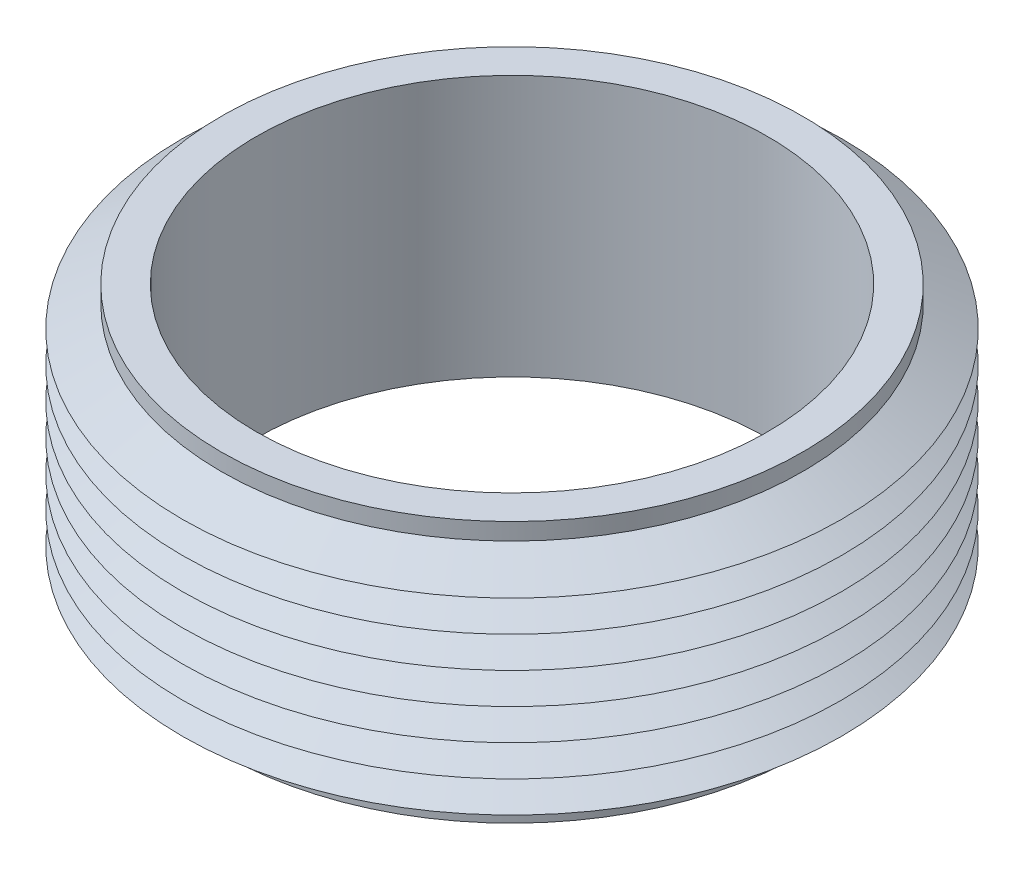
ISO-10303-21;
HEADER;
FILE_DESCRIPTION(('STEP AP214'),'2;1');
FILE_NAME('part.step','',(''),(''),'','','');
FILE_SCHEMA(('AUTOMOTIVE_DESIGN { 1 0 10303 214 1 1 1 1 }'));
ENDSEC;
DATA;
#1=APPLICATION_CONTEXT('core data for automotive mechanical design processes');
#2=APPLICATION_PROTOCOL_DEFINITION('international standard','automotive_design',2000,#1);
#3=PRODUCT_CONTEXT('',#1,'mechanical');
#4=PRODUCT('Part','Part','',(#3));
#5=PRODUCT_RELATED_PRODUCT_CATEGORY('part','',(#4));
#6=PRODUCT_DEFINITION_FORMATION('','',#4);
#7=PRODUCT_DEFINITION_CONTEXT('part definition',#1,'design');
#8=PRODUCT_DEFINITION('design','',#6,#7);
#9=PRODUCT_DEFINITION_SHAPE('','',#8);
#10=(LENGTH_UNIT() NAMED_UNIT(*) SI_UNIT(.MILLI.,.METRE.));
#11=(NAMED_UNIT(*) PLANE_ANGLE_UNIT() SI_UNIT($,.RADIAN.));
#12=(NAMED_UNIT(*) SI_UNIT($,.STERADIAN.) SOLID_ANGLE_UNIT());
#13=UNCERTAINTY_MEASURE_WITH_UNIT(LENGTH_MEASURE(1.E-05),#10,'distance_accuracy_value','');
#14=(GEOMETRIC_REPRESENTATION_CONTEXT(3) GLOBAL_UNCERTAINTY_ASSIGNED_CONTEXT((#13)) GLOBAL_UNIT_ASSIGNED_CONTEXT((#10,
#11,#12)) REPRESENTATION_CONTEXT('',''));
#15=CARTESIAN_POINT('',(0.,0.,0.));
#16=DIRECTION('',(0.,0.,1.));
#17=DIRECTION('',(1.,0.,0.));
#18=AXIS2_PLACEMENT_3D('',#15,#16,#17);
#19=CARTESIAN_POINT('',(40.5,-1.,0.));
#20=DIRECTION('',(0.,1.,0.));
#21=DIRECTION('',(0.,0.,1.));
#22=AXIS2_PLACEMENT_3D('',#19,#20,#21);
#23=PLANE('',#22);
#24=CARTESIAN_POINT('',(0.,-1.,0.));
#25=DIRECTION('',(0.,1.,0.));
#26=DIRECTION('',(0.,0.,1.));
#27=AXIS2_PLACEMENT_3D('',#24,#25,#26);
#28=CIRCLE('',#27,41.5);
#29=CARTESIAN_POINT('',(0.,-1.,41.5));
#30=VERTEX_POINT('',#29);
#31=EDGE_CURVE('E10',#30,#30,#28,.T.);
#32=ORIENTED_EDGE('',*,*,#31,.F.);
#33=EDGE_LOOP('',(#32));
#34=FACE_BOUND('',#33,.T.);
#35=CARTESIAN_POINT('',(0.,-1.,0.));
#36=DIRECTION('',(0.,1.,0.));
#37=DIRECTION('',(0.,0.,1.));
#38=AXIS2_PLACEMENT_3D('',#35,#36,#37);
#39=CIRCLE('',#38,36.5);
#40=CARTESIAN_POINT('',(0.,-1.,36.5));
#41=VERTEX_POINT('',#40);
#42=EDGE_CURVE('E93',#41,#41,#39,.T.);
#43=ORIENTED_EDGE('',*,*,#42,.T.);
#44=EDGE_LOOP('',(#43));
#45=FACE_BOUND('',#44,.T.);
#46=ADVANCED_FACE('F32',(#34,#45),#23,.F.);
#47=CARTESIAN_POINT('',(0.,76.3194927690471,0.));
#48=DIRECTION('',(0.,1.,0.));
#49=DIRECTION('',(0.,0.,1.));
#50=AXIS2_PLACEMENT_3D('',#47,#48,#49);
#51=CYLINDRICAL_SURFACE('',#50,41.5);
#52=CARTESIAN_POINT('',(0.,1.36100673955093,0.));
#53=DIRECTION('',(0.,1.,0.));
#54=DIRECTION('',(0.,0.,1.));
#55=AXIS2_PLACEMENT_3D('',#52,#53,#54);
#56=CIRCLE('',#55,41.5);
#57=CARTESIAN_POINT('',(0.,1.36100673955093,41.5));
#58=VERTEX_POINT('',#57);
#59=EDGE_CURVE('E38',#58,#58,#56,.T.);
#60=ORIENTED_EDGE('',*,*,#59,.F.);
#61=EDGE_LOOP('',(#60));
#62=FACE_BOUND('',#61,.T.);
#63=ORIENTED_EDGE('',*,*,#31,.T.);
#64=EDGE_LOOP('',(#63));
#65=FACE_BOUND('',#64,.T.);
#66=ADVANCED_FACE('F238',(#62,#65),#51,.T.);
#67=CARTESIAN_POINT('',(0.,1.36100673955093,0.));
#68=DIRECTION('',(0.,1.,0.));
#69=DIRECTION('',(0.,0.,1.));
#70=AXIS2_PLACEMENT_3D('',#67,#68,#69);
#71=CONICAL_SURFACE('',#70,41.5,1.13719732465308);
#72=CARTESIAN_POINT('',(0.,3.93133075688284,0.));
#73=DIRECTION('',(0.,1.,0.));
#74=DIRECTION('',(0.,0.,1.));
#75=AXIS2_PLACEMENT_3D('',#72,#73,#74);
#76=CIRCLE('',#75,47.0516447797126);
#77=CARTESIAN_POINT('',(0.,3.93133075688284,47.0516447797126));
#78=VERTEX_POINT('',#77);
#79=EDGE_CURVE('E42',#78,#78,#76,.T.);
#80=ORIENTED_EDGE('',*,*,#79,.F.);
#81=EDGE_LOOP('',(#80));
#82=FACE_BOUND('',#81,.T.);
#83=ORIENTED_EDGE('',*,*,#59,.T.);
#84=EDGE_LOOP('',(#83));
#85=FACE_BOUND('',#84,.T.);
#86=ADVANCED_FACE('F235',(#82,#85),#71,.T.);
#87=CARTESIAN_POINT('',(0.,3.93133075688284,0.));
#88=DIRECTION('',(0.,-1.,0.));
#89=DIRECTION('',(0.,0.,-1.));
#90=AXIS2_PLACEMENT_3D('',#87,#88,#89);
#91=CONICAL_SURFACE('',#90,47.0516447797126,1.05848016422756);
#92=CARTESIAN_POINT('',(0.,6.38231752586066,0.));
#93=DIRECTION('',(0.,1.,0.));
#94=DIRECTION('',(0.,0.,1.));
#95=AXIS2_PLACEMENT_3D('',#92,#93,#94);
#96=CIRCLE('',#95,42.6935874305838);
#97=CARTESIAN_POINT('',(0.,6.38231752586066,42.6935874305838));
#98=VERTEX_POINT('',#97);
#99=EDGE_CURVE('E46',#98,#98,#96,.T.);
#100=ORIENTED_EDGE('',*,*,#99,.F.);
#101=EDGE_LOOP('',(#100));
#102=FACE_BOUND('',#101,.T.);
#103=ORIENTED_EDGE('',*,*,#79,.T.);
#104=EDGE_LOOP('',(#103));
#105=FACE_BOUND('',#104,.T.);
#106=ADVANCED_FACE('F231',(#102,#105),#91,.T.);
#107=CARTESIAN_POINT('',(0.,6.38231752586066,0.));
#108=DIRECTION('',(0.,1.,0.));
#109=DIRECTION('',(0.,0.,1.));
#110=AXIS2_PLACEMENT_3D('',#107,#108,#109);
#111=CONICAL_SURFACE('',#110,42.6935874305838,1.13719732465308);
#112=CARTESIAN_POINT('',(0.,8.4000293784471,0.));
#113=DIRECTION('',(0.,1.,0.));
#114=DIRECTION('',(0.,0.,1.));
#115=AXIS2_PLACEMENT_3D('',#112,#113,#114);
#116=CIRCLE('',#115,47.0516447797126);
#117=CARTESIAN_POINT('',(0.,8.4000293784471,47.0516447797126));
#118=VERTEX_POINT('',#117);
#119=EDGE_CURVE('E51',#118,#118,#116,.T.);
#120=ORIENTED_EDGE('',*,*,#119,.F.);
#121=EDGE_LOOP('',(#120));
#122=FACE_BOUND('',#121,.T.);
#123=ORIENTED_EDGE('',*,*,#99,.T.);
#124=EDGE_LOOP('',(#123));
#125=FACE_BOUND('',#124,.T.);
#126=ADVANCED_FACE('F227',(#122,#125),#111,.T.);
#127=CARTESIAN_POINT('',(0.,8.4000293784471,0.));
#128=DIRECTION('',(0.,-1.,0.));
#129=DIRECTION('',(0.,0.,-1.));
#130=AXIS2_PLACEMENT_3D('',#127,#128,#129);
#131=CONICAL_SURFACE('',#130,47.0516447797126,1.05848016422756);
#132=CARTESIAN_POINT('',(0.,10.8510161474249,0.));
#133=DIRECTION('',(0.,1.,0.));
#134=DIRECTION('',(0.,0.,1.));
#135=AXIS2_PLACEMENT_3D('',#132,#133,#134);
#136=CIRCLE('',#135,42.6935874305838);
#137=CARTESIAN_POINT('',(0.,10.8510161474249,42.6935874305838));
#138=VERTEX_POINT('',#137);
#139=EDGE_CURVE('E54',#138,#138,#136,.T.);
#140=ORIENTED_EDGE('',*,*,#139,.F.);
#141=EDGE_LOOP('',(#140));
#142=FACE_BOUND('',#141,.T.);
#143=ORIENTED_EDGE('',*,*,#119,.T.);
#144=EDGE_LOOP('',(#143));
#145=FACE_BOUND('',#144,.T.);
#146=ADVANCED_FACE('F223',(#142,#145),#131,.T.);
#147=CARTESIAN_POINT('',(0.,10.8510161474249,0.));
#148=DIRECTION('',(0.,1.,0.));
#149=DIRECTION('',(0.,0.,1.));
#150=AXIS2_PLACEMENT_3D('',#147,#148,#149);
#151=CONICAL_SURFACE('',#150,42.6935874305838,1.13719732465307);
#152=CARTESIAN_POINT('',(0.,12.8687280000113,0.));
#153=DIRECTION('',(0.,1.,0.));
#154=DIRECTION('',(0.,0.,1.));
#155=AXIS2_PLACEMENT_3D('',#152,#153,#154);
#156=CIRCLE('',#155,47.0516447797126);
#157=CARTESIAN_POINT('',(0.,12.8687280000113,47.0516447797126));
#158=VERTEX_POINT('',#157);
#159=EDGE_CURVE('E57',#158,#158,#156,.T.);
#160=ORIENTED_EDGE('',*,*,#159,.F.);
#161=EDGE_LOOP('',(#160));
#162=FACE_BOUND('',#161,.T.);
#163=ORIENTED_EDGE('',*,*,#139,.T.);
#164=EDGE_LOOP('',(#163));
#165=FACE_BOUND('',#164,.T.);
#166=ADVANCED_FACE('F219',(#162,#165),#151,.T.);
#167=CARTESIAN_POINT('',(0.,12.8687280000113,0.));
#168=DIRECTION('',(0.,-1.,0.));
#169=DIRECTION('',(0.,0.,-1.));
#170=AXIS2_PLACEMENT_3D('',#167,#168,#169);
#171=CONICAL_SURFACE('',#170,47.0516447797126,1.05848016422756);
#172=CARTESIAN_POINT('',(0.,15.3197147689891,0.));
#173=DIRECTION('',(0.,1.,0.));
#174=DIRECTION('',(0.,0.,1.));
#175=AXIS2_PLACEMENT_3D('',#172,#173,#174);
#176=CIRCLE('',#175,42.6935874305838);
#177=CARTESIAN_POINT('',(0.,15.3197147689891,42.6935874305838));
#178=VERTEX_POINT('',#177);
#179=EDGE_CURVE('E60',#178,#178,#176,.T.);
#180=ORIENTED_EDGE('',*,*,#179,.F.);
#181=EDGE_LOOP('',(#180));
#182=FACE_BOUND('',#181,.T.);
#183=ORIENTED_EDGE('',*,*,#159,.T.);
#184=EDGE_LOOP('',(#183));
#185=FACE_BOUND('',#184,.T.);
#186=ADVANCED_FACE('F215',(#182,#185),#171,.T.);
#187=CARTESIAN_POINT('',(0.,15.3197147689891,0.));
#188=DIRECTION('',(0.,1.,0.));
#189=DIRECTION('',(0.,0.,1.));
#190=AXIS2_PLACEMENT_3D('',#187,#188,#189);
#191=CONICAL_SURFACE('',#190,42.6935874305838,1.13719732465308);
#192=CARTESIAN_POINT('',(0.,17.3374266215756,0.));
#193=DIRECTION('',(0.,1.,0.));
#194=DIRECTION('',(0.,0.,1.));
#195=AXIS2_PLACEMENT_3D('',#192,#193,#194);
#196=CIRCLE('',#195,47.0516447797126);
#197=CARTESIAN_POINT('',(0.,17.3374266215756,47.0516447797126));
#198=VERTEX_POINT('',#197);
#199=EDGE_CURVE('E63',#198,#198,#196,.T.);
#200=ORIENTED_EDGE('',*,*,#199,.F.);
#201=EDGE_LOOP('',(#200));
#202=FACE_BOUND('',#201,.T.);
#203=ORIENTED_EDGE('',*,*,#179,.T.);
#204=EDGE_LOOP('',(#203));
#205=FACE_BOUND('',#204,.T.);
#206=ADVANCED_FACE('F211',(#202,#205),#191,.T.);
#207=CARTESIAN_POINT('',(0.,17.3374266215756,0.));
#208=DIRECTION('',(0.,-1.,0.));
#209=DIRECTION('',(0.,0.,-1.));
#210=AXIS2_PLACEMENT_3D('',#207,#208,#209);
#211=CONICAL_SURFACE('',#210,47.0516447797126,1.05848016422756);
#212=CARTESIAN_POINT('',(0.,19.7884133905534,0.));
#213=DIRECTION('',(0.,1.,0.));
#214=DIRECTION('',(0.,0.,1.));
#215=AXIS2_PLACEMENT_3D('',#212,#213,#214);
#216=CIRCLE('',#215,42.6935874305838);
#217=CARTESIAN_POINT('',(0.,19.7884133905534,42.6935874305838));
#218=VERTEX_POINT('',#217);
#219=EDGE_CURVE('E66',#218,#218,#216,.T.);
#220=ORIENTED_EDGE('',*,*,#219,.F.);
#221=EDGE_LOOP('',(#220));
#222=FACE_BOUND('',#221,.T.);
#223=ORIENTED_EDGE('',*,*,#199,.T.);
#224=EDGE_LOOP('',(#223));
#225=FACE_BOUND('',#224,.T.);
#226=ADVANCED_FACE('F207',(#222,#225),#211,.T.);
#227=CARTESIAN_POINT('',(0.,19.7884133905534,0.));
#228=DIRECTION('',(0.,1.,0.));
#229=DIRECTION('',(0.,0.,1.));
#230=AXIS2_PLACEMENT_3D('',#227,#228,#229);
#231=CONICAL_SURFACE('',#230,42.6935874305838,1.13719732465308);
#232=CARTESIAN_POINT('',(0.,21.8061252431398,0.));
#233=DIRECTION('',(0.,1.,0.));
#234=DIRECTION('',(0.,0.,1.));
#235=AXIS2_PLACEMENT_3D('',#232,#233,#234);
#236=CIRCLE('',#235,47.0516447797126);
#237=CARTESIAN_POINT('',(0.,21.8061252431398,47.0516447797126));
#238=VERTEX_POINT('',#237);
#239=EDGE_CURVE('E69',#238,#238,#236,.T.);
#240=ORIENTED_EDGE('',*,*,#239,.F.);
#241=EDGE_LOOP('',(#240));
#242=FACE_BOUND('',#241,.T.);
#243=ORIENTED_EDGE('',*,*,#219,.T.);
#244=EDGE_LOOP('',(#243));
#245=FACE_BOUND('',#244,.T.);
#246=ADVANCED_FACE('F203',(#242,#245),#231,.T.);
#247=CARTESIAN_POINT('',(0.,21.8061252431398,0.));
#248=DIRECTION('',(0.,-1.,0.));
#249=DIRECTION('',(0.,0.,-1.));
#250=AXIS2_PLACEMENT_3D('',#247,#248,#249);
#251=CONICAL_SURFACE('',#250,47.0516447797126,1.05848016422756);
#252=CARTESIAN_POINT('',(0.,24.2571120121176,0.));
#253=DIRECTION('',(0.,1.,0.));
#254=DIRECTION('',(0.,0.,1.));
#255=AXIS2_PLACEMENT_3D('',#252,#253,#254);
#256=CIRCLE('',#255,42.6935874305838);
#257=CARTESIAN_POINT('',(0.,24.2571120121176,42.6935874305838));
#258=VERTEX_POINT('',#257);
#259=EDGE_CURVE('E72',#258,#258,#256,.T.);
#260=ORIENTED_EDGE('',*,*,#259,.F.);
#261=EDGE_LOOP('',(#260));
#262=FACE_BOUND('',#261,.T.);
#263=ORIENTED_EDGE('',*,*,#239,.T.);
#264=EDGE_LOOP('',(#263));
#265=FACE_BOUND('',#264,.T.);
#266=ADVANCED_FACE('F199',(#262,#265),#251,.T.);
#267=CARTESIAN_POINT('',(0.,24.2571120121176,0.));
#268=DIRECTION('',(0.,1.,0.));
#269=DIRECTION('',(0.,0.,1.));
#270=AXIS2_PLACEMENT_3D('',#267,#268,#269);
#271=CONICAL_SURFACE('',#270,42.6935874305838,1.13719732465308);
#272=CARTESIAN_POINT('',(0.,26.274823864704,0.));
#273=DIRECTION('',(0.,1.,0.));
#274=DIRECTION('',(0.,0.,1.));
#275=AXIS2_PLACEMENT_3D('',#272,#273,#274);
#276=CIRCLE('',#275,47.0516447797126);
#277=CARTESIAN_POINT('',(0.,26.274823864704,47.0516447797126));
#278=VERTEX_POINT('',#277);
#279=EDGE_CURVE('E75',#278,#278,#276,.T.);
#280=ORIENTED_EDGE('',*,*,#279,.F.);
#281=EDGE_LOOP('',(#280));
#282=FACE_BOUND('',#281,.T.);
#283=ORIENTED_EDGE('',*,*,#259,.T.);
#284=EDGE_LOOP('',(#283));
#285=FACE_BOUND('',#284,.T.);
#286=ADVANCED_FACE('F195',(#282,#285),#271,.T.);
#287=CARTESIAN_POINT('',(0.,26.274823864704,0.));
#288=DIRECTION('',(0.,-1.,0.));
#289=DIRECTION('',(0.,0.,-1.));
#290=AXIS2_PLACEMENT_3D('',#287,#288,#289);
#291=CONICAL_SURFACE('',#290,47.0516447797126,1.05848016422756);
#292=CARTESIAN_POINT('',(0.,28.7258106336818,0.));
#293=DIRECTION('',(0.,1.,0.));
#294=DIRECTION('',(0.,0.,1.));
#295=AXIS2_PLACEMENT_3D('',#292,#293,#294);
#296=CIRCLE('',#295,42.6935874305838);
#297=CARTESIAN_POINT('',(0.,28.7258106336818,42.6935874305838));
#298=VERTEX_POINT('',#297);
#299=EDGE_CURVE('E78',#298,#298,#296,.T.);
#300=ORIENTED_EDGE('',*,*,#299,.F.);
#301=EDGE_LOOP('',(#300));
#302=FACE_BOUND('',#301,.T.);
#303=ORIENTED_EDGE('',*,*,#279,.T.);
#304=EDGE_LOOP('',(#303));
#305=FACE_BOUND('',#304,.T.);
#306=ADVANCED_FACE('F191',(#302,#305),#291,.T.);
#307=CARTESIAN_POINT('',(0.,28.7258106336818,0.));
#308=DIRECTION('',(0.,1.,0.));
#309=DIRECTION('',(0.,0.,1.));
#310=AXIS2_PLACEMENT_3D('',#307,#308,#309);
#311=CONICAL_SURFACE('',#310,42.6935874305838,1.13719732465307);
#312=CARTESIAN_POINT('',(0.,30.7435224862683,0.));
#313=DIRECTION('',(0.,1.,0.));
#314=DIRECTION('',(0.,0.,1.));
#315=AXIS2_PLACEMENT_3D('',#312,#313,#314);
#316=CIRCLE('',#315,47.0516447797126);
#317=CARTESIAN_POINT('',(0.,30.7435224862683,47.0516447797126));
#318=VERTEX_POINT('',#317);
#319=EDGE_CURVE('E81',#318,#318,#316,.T.);
#320=ORIENTED_EDGE('',*,*,#319,.F.);
#321=EDGE_LOOP('',(#320));
#322=FACE_BOUND('',#321,.T.);
#323=ORIENTED_EDGE('',*,*,#299,.T.);
#324=EDGE_LOOP('',(#323));
#325=FACE_BOUND('',#324,.T.);
#326=ADVANCED_FACE('F187',(#322,#325),#311,.T.);
#327=CARTESIAN_POINT('',(0.,30.7435224862683,0.));
#328=DIRECTION('',(0.,-1.,0.));
#329=DIRECTION('',(0.,0.,-1.));
#330=AXIS2_PLACEMENT_3D('',#327,#328,#329);
#331=CONICAL_SURFACE('',#330,47.0516447797126,1.05848016422756);
#332=CARTESIAN_POINT('',(0.,33.8657870209147,0.));
#333=DIRECTION('',(0.,1.,0.));
#334=DIRECTION('',(0.,0.,1.));
#335=AXIS2_PLACEMENT_3D('',#332,#333,#334);
#336=CIRCLE('',#335,41.5);
#337=CARTESIAN_POINT('',(0.,33.8657870209147,41.5));
#338=VERTEX_POINT('',#337);
#339=EDGE_CURVE('E84',#338,#338,#336,.T.);
#340=ORIENTED_EDGE('',*,*,#339,.F.);
#341=EDGE_LOOP('',(#340));
#342=FACE_BOUND('',#341,.T.);
#343=ORIENTED_EDGE('',*,*,#319,.T.);
#344=EDGE_LOOP('',(#343));
#345=FACE_BOUND('',#344,.T.);
#346=ADVANCED_FACE('F183',(#342,#345),#331,.T.);
#347=CARTESIAN_POINT('',(0.,76.3194927690471,0.));
#348=DIRECTION('',(0.,1.,0.));
#349=DIRECTION('',(0.,0.,1.));
#350=AXIS2_PLACEMENT_3D('',#347,#348,#349);
#351=CYLINDRICAL_SURFACE('',#350,41.5);
#352=CARTESIAN_POINT('',(0.,36.2808903509497,0.));
#353=DIRECTION('',(0.,1.,0.));
#354=DIRECTION('',(0.,0.,1.));
#355=AXIS2_PLACEMENT_3D('',#352,#353,#354);
#356=CIRCLE('',#355,41.5);
#357=CARTESIAN_POINT('',(0.,36.2808903509497,41.5));
#358=VERTEX_POINT('',#357);
#359=EDGE_CURVE('E87',#358,#358,#356,.T.);
#360=ORIENTED_EDGE('',*,*,#359,.F.);
#361=EDGE_LOOP('',(#360));
#362=FACE_BOUND('',#361,.T.);
#363=ORIENTED_EDGE('',*,*,#339,.T.);
#364=EDGE_LOOP('',(#363));
#365=FACE_BOUND('',#364,.T.);
#366=ADVANCED_FACE('F179',(#362,#365),#351,.T.);
#367=CARTESIAN_POINT('',(40.5,36.2808903509497,0.));
#368=DIRECTION('',(0.,-1.,0.));
#369=DIRECTION('',(0.,0.,-1.));
#370=AXIS2_PLACEMENT_3D('',#367,#368,#369);
#371=PLANE('',#370);
#372=CARTESIAN_POINT('',(0.,36.2808903509497,0.));
#373=DIRECTION('',(0.,1.,0.));
#374=DIRECTION('',(0.,0.,1.));
#375=AXIS2_PLACEMENT_3D('',#372,#373,#374);
#376=CIRCLE('',#375,36.5);
#377=CARTESIAN_POINT('',(0.,36.2808903509497,36.5));
#378=VERTEX_POINT('',#377);
#379=EDGE_CURVE('E90',#378,#378,#376,.T.);
#380=ORIENTED_EDGE('',*,*,#379,.F.);
#381=EDGE_LOOP('',(#380));
#382=FACE_BOUND('',#381,.T.);
#383=ORIENTED_EDGE('',*,*,#359,.T.);
#384=EDGE_LOOP('',(#383));
#385=FACE_BOUND('',#384,.T.);
#386=ADVANCED_FACE('F175',(#382,#385),#371,.F.);
#387=CARTESIAN_POINT('',(0.,76.3194927690471,0.));
#388=DIRECTION('',(0.,1.,0.));
#389=DIRECTION('',(0.,0.,1.));
#390=AXIS2_PLACEMENT_3D('',#387,#388,#389);
#391=CYLINDRICAL_SURFACE('',#390,36.5);
#392=ORIENTED_EDGE('',*,*,#42,.F.);
#393=EDGE_LOOP('',(#392));
#394=FACE_BOUND('',#393,.T.);
#395=ORIENTED_EDGE('',*,*,#379,.T.);
#396=EDGE_LOOP('',(#395));
#397=FACE_BOUND('',#396,.T.);
#398=ADVANCED_FACE('F173',(#394,#397),#391,.F.);
#399=CLOSED_SHELL('',(#46,#66,#86,#106,#126,#146,#166,#186,#206,#226,#246,#266,#286,#306,#326,
#346,#366,#386,#398));
#400=CARTESIAN_POINT('',(40.5,0.,0.));
#401=DIRECTION('',(0.,1.,0.));
#402=DIRECTION('',(0.,0.,1.));
#403=AXIS2_PLACEMENT_3D('',#400,#401,#402);
#404=PLANE('',#403);
#405=CARTESIAN_POINT('',(0.,0.,0.));
#406=DIRECTION('',(0.,1.,0.));
#407=DIRECTION('',(0.,0.,1.));
#408=AXIS2_PLACEMENT_3D('',#405,#406,#407);
#409=CIRCLE('',#408,40.5);
#410=CARTESIAN_POINT('',(0.,0.,40.5));
#411=VERTEX_POINT('',#410);
#412=EDGE_CURVE('E96',#411,#411,#409,.T.);
#413=ORIENTED_EDGE('',*,*,#412,.T.);
#414=EDGE_LOOP('',(#413));
#415=FACE_BOUND('',#414,.T.);
#416=CARTESIAN_POINT('',(0.,0.,0.));
#417=DIRECTION('',(0.,1.,0.));
#418=DIRECTION('',(0.,0.,1.));
#419=AXIS2_PLACEMENT_3D('',#416,#417,#418);
#420=CIRCLE('',#419,37.5);
#421=CARTESIAN_POINT('',(0.,0.,37.5));
#422=VERTEX_POINT('',#421);
#423=EDGE_CURVE('E150',#422,#422,#420,.T.);
#424=ORIENTED_EDGE('',*,*,#423,.F.);
#425=EDGE_LOOP('',(#424));
#426=FACE_BOUND('',#425,.T.);
#427=ADVANCED_FACE('F157',(#415,#426),#404,.T.);
#428=CARTESIAN_POINT('',(0.,76.3194927690471,0.));
#429=DIRECTION('',(0.,1.,0.));
#430=DIRECTION('',(0.,0.,1.));
#431=AXIS2_PLACEMENT_3D('',#428,#429,#430);
#432=CYLINDRICAL_SURFACE('',#431,40.5);
#433=CARTESIAN_POINT('',(0.,2.,0.));
#434=DIRECTION('',(0.,1.,0.));
#435=DIRECTION('',(0.,0.,1.));
#436=AXIS2_PLACEMENT_3D('',#433,#434,#435);
#437=CIRCLE('',#436,40.5);
#438=CARTESIAN_POINT('',(0.,2.,40.5));
#439=VERTEX_POINT('',#438);
#440=EDGE_CURVE('E99',#439,#439,#437,.T.);
#441=ORIENTED_EDGE('',*,*,#440,.T.);
#442=EDGE_LOOP('',(#441));
#443=FACE_BOUND('',#442,.T.);
#444=ORIENTED_EDGE('',*,*,#412,.F.);
#445=EDGE_LOOP('',(#444));
#446=FACE_BOUND('',#445,.T.);
#447=ADVANCED_FACE('F159',(#443,#446),#432,.F.);
#448=CARTESIAN_POINT('',(0.,2.,0.));
#449=DIRECTION('',(0.,1.,0.));
#450=DIRECTION('',(0.,0.,1.));
#451=AXIS2_PLACEMENT_3D('',#448,#449,#450);
#452=CONICAL_SURFACE('',#451,40.5,1.13719732465308);
#453=CARTESIAN_POINT('',(0.,4.01771185258644,0.));
#454=DIRECTION('',(0.,1.,0.));
#455=DIRECTION('',(0.,0.,1.));
#456=AXIS2_PLACEMENT_3D('',#453,#454,#455);
#457=CIRCLE('',#456,44.8580573491288);
#458=CARTESIAN_POINT('',(0.,4.01771185258644,44.8580573491288));
#459=VERTEX_POINT('',#458);
#460=EDGE_CURVE('E102',#459,#459,#457,.T.);
#461=ORIENTED_EDGE('',*,*,#460,.T.);
#462=EDGE_LOOP('',(#461));
#463=FACE_BOUND('',#462,.T.);
#464=ORIENTED_EDGE('',*,*,#440,.F.);
#465=EDGE_LOOP('',(#464));
#466=FACE_BOUND('',#465,.T.);
#467=ADVANCED_FACE('F167',(#463,#466),#452,.F.);
#468=CARTESIAN_POINT('',(0.,4.01771185258644,0.));
#469=DIRECTION('',(0.,-1.,0.));
#470=DIRECTION('',(0.,0.,-1.));
#471=AXIS2_PLACEMENT_3D('',#468,#469,#470);
#472=CONICAL_SURFACE('',#471,44.8580573491288,1.05848016422756);
#473=CARTESIAN_POINT('',(0.,6.46869862156424,0.));
#474=DIRECTION('',(0.,1.,0.));
#475=DIRECTION('',(0.,0.,1.));
#476=AXIS2_PLACEMENT_3D('',#473,#474,#475);
#477=CIRCLE('',#476,40.5);
#478=CARTESIAN_POINT('',(0.,6.46869862156424,40.5));
#479=VERTEX_POINT('',#478);
#480=EDGE_CURVE('E105',#479,#479,#477,.T.);
#481=ORIENTED_EDGE('',*,*,#480,.T.);
#482=EDGE_LOOP('',(#481));
#483=FACE_BOUND('',#482,.T.);
#484=ORIENTED_EDGE('',*,*,#460,.F.);
#485=EDGE_LOOP('',(#484));
#486=FACE_BOUND('',#485,.T.);
#487=ADVANCED_FACE('F407',(#483,#486),#472,.F.);
#488=CARTESIAN_POINT('',(0.,6.46869862156424,0.));
#489=DIRECTION('',(0.,1.,0.));
#490=DIRECTION('',(0.,0.,1.));
#491=AXIS2_PLACEMENT_3D('',#488,#489,#490);
#492=CONICAL_SURFACE('',#491,40.5,1.13719732465308);
#493=CARTESIAN_POINT('',(0.,8.48641047415068,0.));
#494=DIRECTION('',(0.,1.,0.));
#495=DIRECTION('',(0.,0.,1.));
#496=AXIS2_PLACEMENT_3D('',#493,#494,#495);
#497=CIRCLE('',#496,44.8580573491288);
#498=CARTESIAN_POINT('',(0.,8.48641047415068,44.8580573491288));
#499=VERTEX_POINT('',#498);
#500=EDGE_CURVE('E108',#499,#499,#497,.T.);
#501=ORIENTED_EDGE('',*,*,#500,.T.);
#502=EDGE_LOOP('',(#501));
#503=FACE_BOUND('',#502,.T.);
#504=ORIENTED_EDGE('',*,*,#480,.F.);
#505=EDGE_LOOP('',(#504));
#506=FACE_BOUND('',#505,.T.);
#507=ADVANCED_FACE('F416',(#503,#506),#492,.F.);
#508=CARTESIAN_POINT('',(0.,8.48641047415068,0.));
#509=DIRECTION('',(0.,-1.,0.));
#510=DIRECTION('',(0.,0.,-1.));
#511=AXIS2_PLACEMENT_3D('',#508,#509,#510);
#512=CONICAL_SURFACE('',#511,44.8580573491288,1.05848016422756);
#513=CARTESIAN_POINT('',(0.,10.9373972431285,0.));
#514=DIRECTION('',(0.,1.,0.));
#515=DIRECTION('',(0.,0.,1.));
#516=AXIS2_PLACEMENT_3D('',#513,#514,#515);
#517=CIRCLE('',#516,40.5);
#518=CARTESIAN_POINT('',(0.,10.9373972431285,40.5));
#519=VERTEX_POINT('',#518);
#520=EDGE_CURVE('E111',#519,#519,#517,.T.);
#521=ORIENTED_EDGE('',*,*,#520,.T.);
#522=EDGE_LOOP('',(#521));
#523=FACE_BOUND('',#522,.T.);
#524=ORIENTED_EDGE('',*,*,#500,.F.);
#525=EDGE_LOOP('',(#524));
#526=FACE_BOUND('',#525,.T.);
#527=ADVANCED_FACE('F426',(#523,#526),#512,.F.);
#528=CARTESIAN_POINT('',(0.,10.9373972431285,0.));
#529=DIRECTION('',(0.,1.,0.));
#530=DIRECTION('',(0.,0.,1.));
#531=AXIS2_PLACEMENT_3D('',#528,#529,#530);
#532=CONICAL_SURFACE('',#531,40.5,1.13719732465308);
#533=CARTESIAN_POINT('',(0.,12.9551090957149,0.));
#534=DIRECTION('',(0.,1.,0.));
#535=DIRECTION('',(0.,0.,1.));
#536=AXIS2_PLACEMENT_3D('',#533,#534,#535);
#537=CIRCLE('',#536,44.8580573491288);
#538=CARTESIAN_POINT('',(0.,12.9551090957149,44.8580573491288));
#539=VERTEX_POINT('',#538);
#540=EDGE_CURVE('E114',#539,#539,#537,.T.);
#541=ORIENTED_EDGE('',*,*,#540,.T.);
#542=EDGE_LOOP('',(#541));
#543=FACE_BOUND('',#542,.T.);
#544=ORIENTED_EDGE('',*,*,#520,.F.);
#545=EDGE_LOOP('',(#544));
#546=FACE_BOUND('',#545,.T.);
#547=ADVANCED_FACE('F436',(#543,#546),#532,.F.);
#548=CARTESIAN_POINT('',(0.,12.9551090957149,0.));
#549=DIRECTION('',(0.,-1.,0.));
#550=DIRECTION('',(0.,0.,-1.));
#551=AXIS2_PLACEMENT_3D('',#548,#549,#550);
#552=CONICAL_SURFACE('',#551,44.8580573491288,1.05848016422756);
#553=CARTESIAN_POINT('',(0.,15.4060958646927,0.));
#554=DIRECTION('',(0.,1.,0.));
#555=DIRECTION('',(0.,0.,1.));
#556=AXIS2_PLACEMENT_3D('',#553,#554,#555);
#557=CIRCLE('',#556,40.5);
#558=CARTESIAN_POINT('',(0.,15.4060958646927,40.5));
#559=VERTEX_POINT('',#558);
#560=EDGE_CURVE('E117',#559,#559,#557,.T.);
#561=ORIENTED_EDGE('',*,*,#560,.T.);
#562=EDGE_LOOP('',(#561));
#563=FACE_BOUND('',#562,.T.);
#564=ORIENTED_EDGE('',*,*,#540,.F.);
#565=EDGE_LOOP('',(#564));
#566=FACE_BOUND('',#565,.T.);
#567=ADVANCED_FACE('F446',(#563,#566),#552,.F.);
#568=CARTESIAN_POINT('',(0.,15.4060958646927,0.));
#569=DIRECTION('',(0.,1.,0.));
#570=DIRECTION('',(0.,0.,1.));
#571=AXIS2_PLACEMENT_3D('',#568,#569,#570);
#572=CONICAL_SURFACE('',#571,40.5,1.13719732465308);
#573=CARTESIAN_POINT('',(0.,17.4238077172792,0.));
#574=DIRECTION('',(0.,1.,0.));
#575=DIRECTION('',(0.,0.,1.));
#576=AXIS2_PLACEMENT_3D('',#573,#574,#575);
#577=CIRCLE('',#576,44.8580573491288);
#578=CARTESIAN_POINT('',(0.,17.4238077172792,44.8580573491288));
#579=VERTEX_POINT('',#578);
#580=EDGE_CURVE('E120',#579,#579,#577,.T.);
#581=ORIENTED_EDGE('',*,*,#580,.T.);
#582=EDGE_LOOP('',(#581));
#583=FACE_BOUND('',#582,.T.);
#584=ORIENTED_EDGE('',*,*,#560,.F.);
#585=EDGE_LOOP('',(#584));
#586=FACE_BOUND('',#585,.T.);
#587=ADVANCED_FACE('F456',(#583,#586),#572,.F.);
#588=CARTESIAN_POINT('',(0.,17.4238077172792,0.));
#589=DIRECTION('',(0.,-1.,0.));
#590=DIRECTION('',(0.,0.,-1.));
#591=AXIS2_PLACEMENT_3D('',#588,#589,#590);
#592=CONICAL_SURFACE('',#591,44.8580573491288,1.05848016422756);
#593=CARTESIAN_POINT('',(0.,19.8747944862569,0.));
#594=DIRECTION('',(0.,1.,0.));
#595=DIRECTION('',(0.,0.,1.));
#596=AXIS2_PLACEMENT_3D('',#593,#594,#595);
#597=CIRCLE('',#596,40.5);
#598=CARTESIAN_POINT('',(0.,19.8747944862569,40.5));
#599=VERTEX_POINT('',#598);
#600=EDGE_CURVE('E123',#599,#599,#597,.T.);
#601=ORIENTED_EDGE('',*,*,#600,.T.);
#602=EDGE_LOOP('',(#601));
#603=FACE_BOUND('',#602,.T.);
#604=ORIENTED_EDGE('',*,*,#580,.F.);
#605=EDGE_LOOP('',(#604));
#606=FACE_BOUND('',#605,.T.);
#607=ADVANCED_FACE('F466',(#603,#606),#592,.F.);
#608=CARTESIAN_POINT('',(0.,19.8747944862569,0.));
#609=DIRECTION('',(0.,1.,0.));
#610=DIRECTION('',(0.,0.,1.));
#611=AXIS2_PLACEMENT_3D('',#608,#609,#610);
#612=CONICAL_SURFACE('',#611,40.5,1.13719732465308);
#613=CARTESIAN_POINT('',(0.,21.8925063388434,0.));
#614=DIRECTION('',(0.,1.,0.));
#615=DIRECTION('',(0.,0.,1.));
#616=AXIS2_PLACEMENT_3D('',#613,#614,#615);
#617=CIRCLE('',#616,44.8580573491288);
#618=CARTESIAN_POINT('',(0.,21.8925063388434,44.8580573491288));
#619=VERTEX_POINT('',#618);
#620=EDGE_CURVE('E126',#619,#619,#617,.T.);
#621=ORIENTED_EDGE('',*,*,#620,.T.);
#622=EDGE_LOOP('',(#621));
#623=FACE_BOUND('',#622,.T.);
#624=ORIENTED_EDGE('',*,*,#600,.F.);
#625=EDGE_LOOP('',(#624));
#626=FACE_BOUND('',#625,.T.);
#627=ADVANCED_FACE('F476',(#623,#626),#612,.F.);
#628=CARTESIAN_POINT('',(0.,21.8925063388434,0.));
#629=DIRECTION('',(0.,-1.,0.));
#630=DIRECTION('',(0.,0.,-1.));
#631=AXIS2_PLACEMENT_3D('',#628,#629,#630);
#632=CONICAL_SURFACE('',#631,44.8580573491288,1.05848016422756);
#633=CARTESIAN_POINT('',(0.,24.3434931078212,0.));
#634=DIRECTION('',(0.,1.,0.));
#635=DIRECTION('',(0.,0.,1.));
#636=AXIS2_PLACEMENT_3D('',#633,#634,#635);
#637=CIRCLE('',#636,40.5);
#638=CARTESIAN_POINT('',(0.,24.3434931078212,40.5));
#639=VERTEX_POINT('',#638);
#640=EDGE_CURVE('E129',#639,#639,#637,.T.);
#641=ORIENTED_EDGE('',*,*,#640,.T.);
#642=EDGE_LOOP('',(#641));
#643=FACE_BOUND('',#642,.T.);
#644=ORIENTED_EDGE('',*,*,#620,.F.);
#645=EDGE_LOOP('',(#644));
#646=FACE_BOUND('',#645,.T.);
#647=ADVANCED_FACE('F486',(#643,#646),#632,.F.);
#648=CARTESIAN_POINT('',(0.,24.3434931078212,0.));
#649=DIRECTION('',(0.,1.,0.));
#650=DIRECTION('',(0.,0.,1.));
#651=AXIS2_PLACEMENT_3D('',#648,#649,#650);
#652=CONICAL_SURFACE('',#651,40.5,1.13719732465308);
#653=CARTESIAN_POINT('',(0.,26.3612049604076,0.));
#654=DIRECTION('',(0.,1.,0.));
#655=DIRECTION('',(0.,0.,1.));
#656=AXIS2_PLACEMENT_3D('',#653,#654,#655);
#657=CIRCLE('',#656,44.8580573491288);
#658=CARTESIAN_POINT('',(0.,26.3612049604076,44.8580573491288));
#659=VERTEX_POINT('',#658);
#660=EDGE_CURVE('E132',#659,#659,#657,.T.);
#661=ORIENTED_EDGE('',*,*,#660,.T.);
#662=EDGE_LOOP('',(#661));
#663=FACE_BOUND('',#662,.T.);
#664=ORIENTED_EDGE('',*,*,#640,.F.);
#665=EDGE_LOOP('',(#664));
#666=FACE_BOUND('',#665,.T.);
#667=ADVANCED_FACE('F496',(#663,#666),#652,.F.);
#668=CARTESIAN_POINT('',(0.,26.3612049604076,0.));
#669=DIRECTION('',(0.,-1.,0.));
#670=DIRECTION('',(0.,0.,-1.));
#671=AXIS2_PLACEMENT_3D('',#668,#669,#670);
#672=CONICAL_SURFACE('',#671,44.8580573491288,1.05848016422756);
#673=CARTESIAN_POINT('',(0.,28.8121917293854,0.));
#674=DIRECTION('',(0.,1.,0.));
#675=DIRECTION('',(0.,0.,1.));
#676=AXIS2_PLACEMENT_3D('',#673,#674,#675);
#677=CIRCLE('',#676,40.5);
#678=CARTESIAN_POINT('',(0.,28.8121917293854,40.5));
#679=VERTEX_POINT('',#678);
#680=EDGE_CURVE('E135',#679,#679,#677,.T.);
#681=ORIENTED_EDGE('',*,*,#680,.T.);
#682=EDGE_LOOP('',(#681));
#683=FACE_BOUND('',#682,.T.);
#684=ORIENTED_EDGE('',*,*,#660,.F.);
#685=EDGE_LOOP('',(#684));
#686=FACE_BOUND('',#685,.T.);
#687=ADVANCED_FACE('F506',(#683,#686),#672,.F.);
#688=CARTESIAN_POINT('',(0.,28.8121917293854,0.));
#689=DIRECTION('',(0.,1.,0.));
#690=DIRECTION('',(0.,0.,1.));
#691=AXIS2_PLACEMENT_3D('',#688,#689,#690);
#692=CONICAL_SURFACE('',#691,40.5,1.13719732465307);
#693=CARTESIAN_POINT('',(0.,30.8299035819719,0.));
#694=DIRECTION('',(0.,1.,0.));
#695=DIRECTION('',(0.,0.,1.));
#696=AXIS2_PLACEMENT_3D('',#693,#694,#695);
#697=CIRCLE('',#696,44.8580573491288);
#698=CARTESIAN_POINT('',(0.,30.8299035819719,44.8580573491288));
#699=VERTEX_POINT('',#698);
#700=EDGE_CURVE('E138',#699,#699,#697,.T.);
#701=ORIENTED_EDGE('',*,*,#700,.T.);
#702=EDGE_LOOP('',(#701));
#703=FACE_BOUND('',#702,.T.);
#704=ORIENTED_EDGE('',*,*,#680,.F.);
#705=EDGE_LOOP('',(#704));
#706=FACE_BOUND('',#705,.T.);
#707=ADVANCED_FACE('F516',(#703,#706),#692,.F.);
#708=CARTESIAN_POINT('',(0.,30.8299035819719,0.));
#709=DIRECTION('',(0.,-1.,0.));
#710=DIRECTION('',(0.,0.,-1.));
#711=AXIS2_PLACEMENT_3D('',#708,#709,#710);
#712=CONICAL_SURFACE('',#711,44.8580573491288,1.05848016422756);
#713=CARTESIAN_POINT('',(0.,33.2808903509497,0.));
#714=DIRECTION('',(0.,1.,0.));
#715=DIRECTION('',(0.,0.,1.));
#716=AXIS2_PLACEMENT_3D('',#713,#714,#715);
#717=CIRCLE('',#716,40.5);
#718=CARTESIAN_POINT('',(0.,33.2808903509497,40.5));
#719=VERTEX_POINT('',#718);
#720=EDGE_CURVE('E141',#719,#719,#717,.T.);
#721=ORIENTED_EDGE('',*,*,#720,.T.);
#722=EDGE_LOOP('',(#721));
#723=FACE_BOUND('',#722,.T.);
#724=ORIENTED_EDGE('',*,*,#700,.F.);
#725=EDGE_LOOP('',(#724));
#726=FACE_BOUND('',#725,.T.);
#727=ADVANCED_FACE('F526',(#723,#726),#712,.F.);
#728=CARTESIAN_POINT('',(0.,76.3194927690471,0.));
#729=DIRECTION('',(0.,1.,0.));
#730=DIRECTION('',(0.,0.,1.));
#731=AXIS2_PLACEMENT_3D('',#728,#729,#730);
#732=CYLINDRICAL_SURFACE('',#731,40.5);
#733=CARTESIAN_POINT('',(0.,35.2808903509497,0.));
#734=DIRECTION('',(0.,1.,0.));
#735=DIRECTION('',(0.,0.,1.));
#736=AXIS2_PLACEMENT_3D('',#733,#734,#735);
#737=CIRCLE('',#736,40.5);
#738=CARTESIAN_POINT('',(0.,35.2808903509497,40.5));
#739=VERTEX_POINT('',#738);
#740=EDGE_CURVE('E144',#739,#739,#737,.T.);
#741=ORIENTED_EDGE('',*,*,#740,.T.);
#742=EDGE_LOOP('',(#741));
#743=FACE_BOUND('',#742,.T.);
#744=ORIENTED_EDGE('',*,*,#720,.F.);
#745=EDGE_LOOP('',(#744));
#746=FACE_BOUND('',#745,.T.);
#747=ADVANCED_FACE('F536',(#743,#746),#732,.F.);
#748=CARTESIAN_POINT('',(40.5,35.2808903509497,0.));
#749=DIRECTION('',(0.,-1.,0.));
#750=DIRECTION('',(0.,0.,-1.));
#751=AXIS2_PLACEMENT_3D('',#748,#749,#750);
#752=PLANE('',#751);
#753=CARTESIAN_POINT('',(0.,35.2808903509497,0.));
#754=DIRECTION('',(0.,1.,0.));
#755=DIRECTION('',(0.,0.,1.));
#756=AXIS2_PLACEMENT_3D('',#753,#754,#755);
#757=CIRCLE('',#756,37.5);
#758=CARTESIAN_POINT('',(0.,35.2808903509497,37.5));
#759=VERTEX_POINT('',#758);
#760=EDGE_CURVE('E147',#759,#759,#757,.T.);
#761=ORIENTED_EDGE('',*,*,#760,.T.);
#762=EDGE_LOOP('',(#761));
#763=FACE_BOUND('',#762,.T.);
#764=ORIENTED_EDGE('',*,*,#740,.F.);
#765=EDGE_LOOP('',(#764));
#766=FACE_BOUND('',#765,.T.);
#767=ADVANCED_FACE('F546',(#763,#766),#752,.T.);
#768=CARTESIAN_POINT('',(0.,76.3194927690471,0.));
#769=DIRECTION('',(0.,1.,0.));
#770=DIRECTION('',(0.,0.,1.));
#771=AXIS2_PLACEMENT_3D('',#768,#769,#770);
#772=CYLINDRICAL_SURFACE('',#771,37.5);
#773=ORIENTED_EDGE('',*,*,#423,.T.);
#774=EDGE_LOOP('',(#773));
#775=FACE_BOUND('',#774,.T.);
#776=ORIENTED_EDGE('',*,*,#760,.F.);
#777=EDGE_LOOP('',(#776));
#778=FACE_BOUND('',#777,.T.);
#779=ADVANCED_FACE('F154',(#775,#778),#772,.T.);
#780=CLOSED_SHELL('',(#427,#447,#467,#487,#507,#527,#547,#567,#587,#607,#627,#647,#667,#687,
#707,#727,#747,#767,#779));
#781=ORIENTED_CLOSED_SHELL('',*,#780,.T.);
#782=BREP_WITH_VOIDS('B2',#399,(#781));
#783=ADVANCED_BREP_SHAPE_REPRESENTATION('',(#18,#782),#14);
#784=SHAPE_DEFINITION_REPRESENTATION(#9,#783);
ENDSEC;
END-ISO-10303-21;
